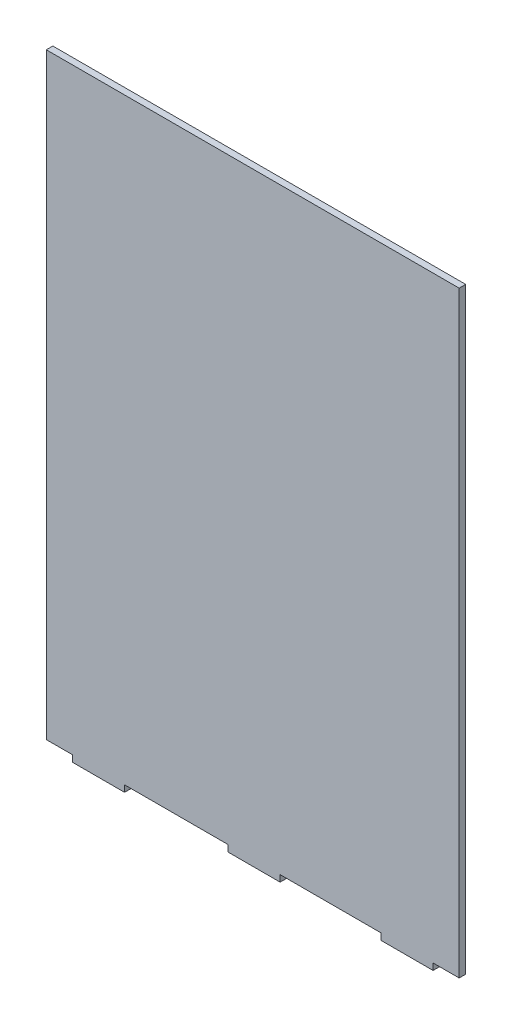
ISO-10303-21;
HEADER;
FILE_DESCRIPTION(('STEP AP214'),'2;1');
FILE_NAME('part.step','',(''),(''),'','','');
FILE_SCHEMA(('AUTOMOTIVE_DESIGN { 1 0 10303 214 1 1 1 1 }'));
ENDSEC;
DATA;
#1=APPLICATION_CONTEXT('core data for automotive mechanical design processes');
#2=APPLICATION_PROTOCOL_DEFINITION('international standard','automotive_design',2000,#1);
#3=PRODUCT_CONTEXT('',#1,'mechanical');
#4=PRODUCT('Part','Part','',(#3));
#5=PRODUCT_RELATED_PRODUCT_CATEGORY('part','',(#4));
#6=PRODUCT_DEFINITION_FORMATION('','',#4);
#7=PRODUCT_DEFINITION_CONTEXT('part definition',#1,'design');
#8=PRODUCT_DEFINITION('design','',#6,#7);
#9=PRODUCT_DEFINITION_SHAPE('','',#8);
#10=(LENGTH_UNIT() NAMED_UNIT(*) SI_UNIT(.MILLI.,.METRE.));
#11=(NAMED_UNIT(*) PLANE_ANGLE_UNIT() SI_UNIT($,.RADIAN.));
#12=(NAMED_UNIT(*) SI_UNIT($,.STERADIAN.) SOLID_ANGLE_UNIT());
#13=UNCERTAINTY_MEASURE_WITH_UNIT(LENGTH_MEASURE(1.E-05),#10,'distance_accuracy_value','');
#14=(GEOMETRIC_REPRESENTATION_CONTEXT(3) GLOBAL_UNCERTAINTY_ASSIGNED_CONTEXT((#13)) GLOBAL_UNIT_ASSIGNED_CONTEXT((#10,
#11,#12)) REPRESENTATION_CONTEXT('',''));
#15=CARTESIAN_POINT('',(0.,0.,0.));
#16=DIRECTION('',(0.,0.,1.));
#17=DIRECTION('',(1.,0.,0.));
#18=AXIS2_PLACEMENT_3D('',#15,#16,#17);
#19=CARTESIAN_POINT('',(0.,0.,3.175));
#20=DIRECTION('',(1.,0.,0.));
#21=DIRECTION('',(0.,0.,-1.));
#22=AXIS2_PLACEMENT_3D('',#19,#20,#21);
#23=PLANE('',#22);
#24=DIRECTION('',(0.,-1.,0.));
#25=VECTOR('',#24,1.);
#26=CARTESIAN_POINT('',(0.,0.,0.));
#27=LINE('',#26,#25);
#28=CARTESIAN_POINT('',(0.,290.83,0.));
#29=VERTEX_POINT('',#28);
#30=CARTESIAN_POINT('',(0.,0.,0.));
#31=VERTEX_POINT('',#30);
#32=EDGE_CURVE('E180',#29,#31,#27,.T.);
#33=ORIENTED_EDGE('',*,*,#32,.T.);
#34=DIRECTION('',(0.,0.,-1.));
#35=VECTOR('',#34,1.);
#36=CARTESIAN_POINT('',(0.,0.,3.175));
#37=LINE('',#36,#35);
#38=CARTESIAN_POINT('',(0.,0.,3.175));
#39=VERTEX_POINT('',#38);
#40=EDGE_CURVE('E11',#39,#31,#37,.T.);
#41=ORIENTED_EDGE('',*,*,#40,.F.);
#42=DIRECTION('',(0.,-1.,0.));
#43=VECTOR('',#42,1.);
#44=CARTESIAN_POINT('',(0.,0.,3.175));
#45=LINE('',#44,#43);
#46=CARTESIAN_POINT('',(0.,290.83,3.175));
#47=VERTEX_POINT('',#46);
#48=EDGE_CURVE('E210',#47,#39,#45,.T.);
#49=ORIENTED_EDGE('',*,*,#48,.F.);
#50=DIRECTION('',(0.,0.,-1.));
#51=VECTOR('',#50,1.);
#52=CARTESIAN_POINT('',(0.,290.83,3.175));
#53=LINE('',#52,#51);
#54=EDGE_CURVE('E176',#47,#29,#53,.T.);
#55=ORIENTED_EDGE('',*,*,#54,.T.);
#56=EDGE_LOOP('',(#33,#41,#49,#55));
#57=FACE_BOUND('',#56,.T.);
#58=ADVANCED_FACE('F36',(#57),#23,.F.);
#59=CARTESIAN_POINT('',(0.,0.,3.175));
#60=DIRECTION('',(0.,1.,0.));
#61=DIRECTION('',(0.,0.,1.));
#62=AXIS2_PLACEMENT_3D('',#59,#60,#61);
#63=PLANE('',#62);
#64=DIRECTION('',(1.,0.,0.));
#65=VECTOR('',#64,1.);
#66=CARTESIAN_POINT('',(0.,0.,0.));
#67=LINE('',#66,#65);
#68=CARTESIAN_POINT('',(12.7,0.,0.));
#69=VERTEX_POINT('',#68);
#70=EDGE_CURVE('E183',#31,#69,#67,.T.);
#71=ORIENTED_EDGE('',*,*,#70,.T.);
#72=DIRECTION('',(0.,0.,-1.));
#73=VECTOR('',#72,1.);
#74=CARTESIAN_POINT('',(12.7,0.,3.175));
#75=LINE('',#74,#73);
#76=CARTESIAN_POINT('',(12.7,0.,3.175));
#77=VERTEX_POINT('',#76);
#78=EDGE_CURVE('E44',#77,#69,#75,.T.);
#79=ORIENTED_EDGE('',*,*,#78,.F.);
#80=DIRECTION('',(1.,0.,0.));
#81=VECTOR('',#80,1.);
#82=CARTESIAN_POINT('',(0.,0.,3.175));
#83=LINE('',#82,#81);
#84=EDGE_CURVE('E119',#39,#77,#83,.T.);
#85=ORIENTED_EDGE('',*,*,#84,.F.);
#86=ORIENTED_EDGE('',*,*,#40,.T.);
#87=EDGE_LOOP('',(#71,#79,#85,#86));
#88=FACE_BOUND('',#87,.T.);
#89=ADVANCED_FACE('F308',(#88),#63,.F.);
#90=CARTESIAN_POINT('',(12.7,-3.175,3.175));
#91=DIRECTION('',(1.,0.,0.));
#92=DIRECTION('',(0.,0.,-1.));
#93=AXIS2_PLACEMENT_3D('',#90,#91,#92);
#94=PLANE('',#93);
#95=DIRECTION('',(0.,-1.,0.));
#96=VECTOR('',#95,1.);
#97=CARTESIAN_POINT('',(12.7,-3.175,0.));
#98=LINE('',#97,#96);
#99=CARTESIAN_POINT('',(12.7,-3.175,0.));
#100=VERTEX_POINT('',#99);
#101=EDGE_CURVE('E185',#69,#100,#98,.T.);
#102=ORIENTED_EDGE('',*,*,#101,.T.);
#103=DIRECTION('',(0.,0.,-1.));
#104=VECTOR('',#103,1.);
#105=CARTESIAN_POINT('',(12.7,-3.175,3.175));
#106=LINE('',#105,#104);
#107=CARTESIAN_POINT('',(12.7,-3.175,3.175));
#108=VERTEX_POINT('',#107);
#109=EDGE_CURVE('E241',#108,#100,#106,.T.);
#110=ORIENTED_EDGE('',*,*,#109,.F.);
#111=DIRECTION('',(0.,-1.,0.));
#112=VECTOR('',#111,1.);
#113=CARTESIAN_POINT('',(12.7,-3.175,3.175));
#114=LINE('',#113,#112);
#115=EDGE_CURVE('E249',#77,#108,#114,.T.);
#116=ORIENTED_EDGE('',*,*,#115,.F.);
#117=ORIENTED_EDGE('',*,*,#78,.T.);
#118=EDGE_LOOP('',(#102,#110,#116,#117));
#119=FACE_BOUND('',#118,.T.);
#120=ADVANCED_FACE('F247',(#119),#94,.F.);
#121=CARTESIAN_POINT('',(12.7,-3.175,3.175));
#122=DIRECTION('',(0.,1.,0.));
#123=DIRECTION('',(-1.,0.,0.));
#124=AXIS2_PLACEMENT_3D('',#121,#122,#123);
#125=PLANE('',#124);
#126=DIRECTION('',(1.,0.,0.));
#127=VECTOR('',#126,1.);
#128=CARTESIAN_POINT('',(12.7,-3.175,0.));
#129=LINE('',#128,#127);
#130=CARTESIAN_POINT('',(38.1,-3.175,0.));
#131=VERTEX_POINT('',#130);
#132=EDGE_CURVE('E187',#100,#131,#129,.T.);
#133=ORIENTED_EDGE('',*,*,#132,.T.);
#134=DIRECTION('',(0.,0.,-1.));
#135=VECTOR('',#134,1.);
#136=CARTESIAN_POINT('',(38.1,-3.175,3.175));
#137=LINE('',#136,#135);
#138=CARTESIAN_POINT('',(38.1,-3.175,3.175));
#139=VERTEX_POINT('',#138);
#140=EDGE_CURVE('E238',#139,#131,#137,.T.);
#141=ORIENTED_EDGE('',*,*,#140,.F.);
#142=DIRECTION('',(1.,0.,0.));
#143=VECTOR('',#142,1.);
#144=CARTESIAN_POINT('',(12.7,-3.175,3.175));
#145=LINE('',#144,#143);
#146=EDGE_CURVE('E267',#108,#139,#145,.T.);
#147=ORIENTED_EDGE('',*,*,#146,.F.);
#148=ORIENTED_EDGE('',*,*,#109,.T.);
#149=EDGE_LOOP('',(#133,#141,#147,#148));
#150=FACE_BOUND('',#149,.T.);
#151=ADVANCED_FACE('F258',(#150),#125,.F.);
#152=CARTESIAN_POINT('',(38.1,-3.175,3.175));
#153=DIRECTION('',(-1.,0.,0.));
#154=DIRECTION('',(0.,0.,1.));
#155=AXIS2_PLACEMENT_3D('',#152,#153,#154);
#156=PLANE('',#155);
#157=DIRECTION('',(0.,1.,0.));
#158=VECTOR('',#157,1.);
#159=CARTESIAN_POINT('',(38.1,-3.175,0.));
#160=LINE('',#159,#158);
#161=CARTESIAN_POINT('',(38.1,0.,0.));
#162=VERTEX_POINT('',#161);
#163=EDGE_CURVE('E189',#131,#162,#160,.T.);
#164=ORIENTED_EDGE('',*,*,#163,.T.);
#165=DIRECTION('',(0.,0.,-1.));
#166=VECTOR('',#165,1.);
#167=CARTESIAN_POINT('',(38.1,0.,3.175));
#168=LINE('',#167,#166);
#169=CARTESIAN_POINT('',(38.1,0.,3.175));
#170=VERTEX_POINT('',#169);
#171=EDGE_CURVE('E235',#170,#162,#168,.T.);
#172=ORIENTED_EDGE('',*,*,#171,.F.);
#173=DIRECTION('',(0.,1.,0.));
#174=VECTOR('',#173,1.);
#175=CARTESIAN_POINT('',(38.1,-3.175,3.175));
#176=LINE('',#175,#174);
#177=EDGE_CURVE('E264',#139,#170,#176,.T.);
#178=ORIENTED_EDGE('',*,*,#177,.F.);
#179=ORIENTED_EDGE('',*,*,#140,.T.);
#180=EDGE_LOOP('',(#164,#172,#178,#179));
#181=FACE_BOUND('',#180,.T.);
#182=ADVANCED_FACE('F262',(#181),#156,.F.);
#183=CARTESIAN_POINT('',(38.1,0.,3.175));
#184=DIRECTION('',(0.,1.,0.));
#185=DIRECTION('',(-1.,0.,0.));
#186=AXIS2_PLACEMENT_3D('',#183,#184,#185);
#187=PLANE('',#186);
#188=DIRECTION('',(1.,0.,0.));
#189=VECTOR('',#188,1.);
#190=CARTESIAN_POINT('',(38.1,0.,0.));
#191=LINE('',#190,#189);
#192=CARTESIAN_POINT('',(88.4153708647125,0.,0.));
#193=VERTEX_POINT('',#192);
#194=EDGE_CURVE('E191',#162,#193,#191,.T.);
#195=ORIENTED_EDGE('',*,*,#194,.T.);
#196=DIRECTION('',(0.,0.,-1.));
#197=VECTOR('',#196,1.);
#198=CARTESIAN_POINT('',(88.4153708647125,0.,3.175));
#199=LINE('',#198,#197);
#200=CARTESIAN_POINT('',(88.4153708647125,0.,3.175));
#201=VERTEX_POINT('',#200);
#202=EDGE_CURVE('E232',#201,#193,#199,.T.);
#203=ORIENTED_EDGE('',*,*,#202,.F.);
#204=DIRECTION('',(1.,0.,0.));
#205=VECTOR('',#204,1.);
#206=CARTESIAN_POINT('',(38.1,0.,3.175));
#207=LINE('',#206,#205);
#208=EDGE_CURVE('E266',#170,#201,#207,.T.);
#209=ORIENTED_EDGE('',*,*,#208,.F.);
#210=ORIENTED_EDGE('',*,*,#171,.T.);
#211=EDGE_LOOP('',(#195,#203,#209,#210));
#212=FACE_BOUND('',#211,.T.);
#213=ADVANCED_FACE('F321',(#212),#187,.F.);
#214=CARTESIAN_POINT('',(88.4153708647125,-3.17499999999999,3.175));
#215=DIRECTION('',(1.,0.,0.));
#216=DIRECTION('',(0.,0.,-1.));
#217=AXIS2_PLACEMENT_3D('',#214,#215,#216);
#218=PLANE('',#217);
#219=DIRECTION('',(0.,-1.,0.));
#220=VECTOR('',#219,1.);
#221=CARTESIAN_POINT('',(88.4153708647125,-3.17499999999999,0.));
#222=LINE('',#221,#220);
#223=CARTESIAN_POINT('',(88.4153708647125,-3.17499999999999,0.));
#224=VERTEX_POINT('',#223);
#225=EDGE_CURVE('E193',#193,#224,#222,.T.);
#226=ORIENTED_EDGE('',*,*,#225,.T.);
#227=DIRECTION('',(0.,0.,-1.));
#228=VECTOR('',#227,1.);
#229=CARTESIAN_POINT('',(88.4153708647125,-3.17499999999999,3.175));
#230=LINE('',#229,#228);
#231=CARTESIAN_POINT('',(88.4153708647125,-3.17499999999999,3.175));
#232=VERTEX_POINT('',#231);
#233=EDGE_CURVE('E229',#232,#224,#230,.T.);
#234=ORIENTED_EDGE('',*,*,#233,.F.);
#235=DIRECTION('',(0.,-1.,0.));
#236=VECTOR('',#235,1.);
#237=CARTESIAN_POINT('',(88.4153708647125,-3.17499999999999,3.175));
#238=LINE('',#237,#236);
#239=EDGE_CURVE('E269',#201,#232,#238,.T.);
#240=ORIENTED_EDGE('',*,*,#239,.F.);
#241=ORIENTED_EDGE('',*,*,#202,.T.);
#242=EDGE_LOOP('',(#226,#234,#240,#241));
#243=FACE_BOUND('',#242,.T.);
#244=ADVANCED_FACE('F324',(#243),#218,.F.);
#245=CARTESIAN_POINT('',(88.4153708647125,-3.17499999999999,3.175));
#246=DIRECTION('',(0.,1.,0.));
#247=DIRECTION('',(-1.,0.,0.));
#248=AXIS2_PLACEMENT_3D('',#245,#246,#247);
#249=PLANE('',#248);
#250=DIRECTION('',(1.,0.,0.));
#251=VECTOR('',#250,1.);
#252=CARTESIAN_POINT('',(88.4153708647125,-3.17499999999999,0.));
#253=LINE('',#252,#251);
#254=CARTESIAN_POINT('',(113.815370864712,-3.175,0.));
#255=VERTEX_POINT('',#254);
#256=EDGE_CURVE('E195',#224,#255,#253,.T.);
#257=ORIENTED_EDGE('',*,*,#256,.T.);
#258=DIRECTION('',(0.,0.,-1.));
#259=VECTOR('',#258,1.);
#260=CARTESIAN_POINT('',(113.815370864712,-3.175,3.175));
#261=LINE('',#260,#259);
#262=CARTESIAN_POINT('',(113.815370864712,-3.175,3.175));
#263=VERTEX_POINT('',#262);
#264=EDGE_CURVE('E226',#263,#255,#261,.T.);
#265=ORIENTED_EDGE('',*,*,#264,.F.);
#266=DIRECTION('',(1.,0.,0.));
#267=VECTOR('',#266,1.);
#268=CARTESIAN_POINT('',(88.4153708647125,-3.17499999999999,3.175));
#269=LINE('',#268,#267);
#270=EDGE_CURVE('E275',#232,#263,#269,.T.);
#271=ORIENTED_EDGE('',*,*,#270,.F.);
#272=ORIENTED_EDGE('',*,*,#233,.T.);
#273=EDGE_LOOP('',(#257,#265,#271,#272));
#274=FACE_BOUND('',#273,.T.);
#275=ADVANCED_FACE('F328',(#274),#249,.F.);
#276=CARTESIAN_POINT('',(113.815370864712,-3.175,3.175));
#277=DIRECTION('',(-1.,0.,0.));
#278=DIRECTION('',(0.,0.,1.));
#279=AXIS2_PLACEMENT_3D('',#276,#277,#278);
#280=PLANE('',#279);
#281=DIRECTION('',(0.,1.,0.));
#282=VECTOR('',#281,1.);
#283=CARTESIAN_POINT('',(113.815370864712,-3.175,0.));
#284=LINE('',#283,#282);
#285=CARTESIAN_POINT('',(113.815370864712,0.,0.));
#286=VERTEX_POINT('',#285);
#287=EDGE_CURVE('E197',#255,#286,#284,.T.);
#288=ORIENTED_EDGE('',*,*,#287,.T.);
#289=DIRECTION('',(0.,0.,-1.));
#290=VECTOR('',#289,1.);
#291=CARTESIAN_POINT('',(113.815370864712,0.,3.175));
#292=LINE('',#291,#290);
#293=CARTESIAN_POINT('',(113.815370864712,0.,3.175));
#294=VERTEX_POINT('',#293);
#295=EDGE_CURVE('E223',#294,#286,#292,.T.);
#296=ORIENTED_EDGE('',*,*,#295,.F.);
#297=DIRECTION('',(0.,1.,0.));
#298=VECTOR('',#297,1.);
#299=CARTESIAN_POINT('',(113.815370864712,-3.175,3.175));
#300=LINE('',#299,#298);
#301=EDGE_CURVE('E277',#263,#294,#300,.T.);
#302=ORIENTED_EDGE('',*,*,#301,.F.);
#303=ORIENTED_EDGE('',*,*,#264,.T.);
#304=EDGE_LOOP('',(#288,#296,#302,#303));
#305=FACE_BOUND('',#304,.T.);
#306=ADVANCED_FACE('F332',(#305),#280,.F.);
#307=CARTESIAN_POINT('',(113.815370864712,0.,3.175));
#308=DIRECTION('',(0.,1.,0.));
#309=DIRECTION('',(0.,0.,1.));
#310=AXIS2_PLACEMENT_3D('',#307,#308,#309);
#311=PLANE('',#310);
#312=DIRECTION('',(1.,0.,0.));
#313=VECTOR('',#312,1.);
#314=CARTESIAN_POINT('',(113.815370864712,0.,0.));
#315=LINE('',#314,#313);
#316=CARTESIAN_POINT('',(162.88004,0.,0.));
#317=VERTEX_POINT('',#316);
#318=EDGE_CURVE('E199',#286,#317,#315,.T.);
#319=ORIENTED_EDGE('',*,*,#318,.T.);
#320=DIRECTION('',(0.,0.,-1.));
#321=VECTOR('',#320,1.);
#322=CARTESIAN_POINT('',(162.88004,0.,3.175));
#323=LINE('',#322,#321);
#324=CARTESIAN_POINT('',(162.88004,0.,3.175));
#325=VERTEX_POINT('',#324);
#326=EDGE_CURVE('E220',#325,#317,#323,.T.);
#327=ORIENTED_EDGE('',*,*,#326,.F.);
#328=DIRECTION('',(1.,0.,0.));
#329=VECTOR('',#328,1.);
#330=CARTESIAN_POINT('',(113.815370864712,0.,3.175));
#331=LINE('',#330,#329);
#332=EDGE_CURVE('E279',#294,#325,#331,.T.);
#333=ORIENTED_EDGE('',*,*,#332,.F.);
#334=ORIENTED_EDGE('',*,*,#295,.T.);
#335=EDGE_LOOP('',(#319,#327,#333,#334));
#336=FACE_BOUND('',#335,.T.);
#337=ADVANCED_FACE('F336',(#336),#311,.F.);
#338=CARTESIAN_POINT('',(162.88004,0.,3.175));
#339=DIRECTION('',(1.,0.,0.));
#340=DIRECTION('',(0.,0.,-1.));
#341=AXIS2_PLACEMENT_3D('',#338,#339,#340);
#342=PLANE('',#341);
#343=DIRECTION('',(0.,-1.,0.));
#344=VECTOR('',#343,1.);
#345=CARTESIAN_POINT('',(162.88004,0.,0.));
#346=LINE('',#345,#344);
#347=CARTESIAN_POINT('',(162.88004,-3.175,0.));
#348=VERTEX_POINT('',#347);
#349=EDGE_CURVE('E201',#317,#348,#346,.T.);
#350=ORIENTED_EDGE('',*,*,#349,.T.);
#351=DIRECTION('',(0.,0.,-1.));
#352=VECTOR('',#351,1.);
#353=CARTESIAN_POINT('',(162.88004,-3.175,3.175));
#354=LINE('',#353,#352);
#355=CARTESIAN_POINT('',(162.88004,-3.175,3.175));
#356=VERTEX_POINT('',#355);
#357=EDGE_CURVE('E217',#356,#348,#354,.T.);
#358=ORIENTED_EDGE('',*,*,#357,.F.);
#359=DIRECTION('',(0.,-1.,0.));
#360=VECTOR('',#359,1.);
#361=CARTESIAN_POINT('',(162.88004,0.,3.175));
#362=LINE('',#361,#360);
#363=EDGE_CURVE('E281',#325,#356,#362,.T.);
#364=ORIENTED_EDGE('',*,*,#363,.F.);
#365=ORIENTED_EDGE('',*,*,#326,.T.);
#366=EDGE_LOOP('',(#350,#358,#364,#365));
#367=FACE_BOUND('',#366,.T.);
#368=ADVANCED_FACE('F340',(#367),#342,.F.);
#369=CARTESIAN_POINT('',(162.88004,-3.175,3.175));
#370=DIRECTION('',(0.,1.,0.));
#371=DIRECTION('',(0.,0.,1.));
#372=AXIS2_PLACEMENT_3D('',#369,#370,#371);
#373=PLANE('',#372);
#374=DIRECTION('',(1.,0.,0.));
#375=VECTOR('',#374,1.);
#376=CARTESIAN_POINT('',(162.88004,-3.175,0.));
#377=LINE('',#376,#375);
#378=CARTESIAN_POINT('',(188.28004,-3.175,0.));
#379=VERTEX_POINT('',#378);
#380=EDGE_CURVE('E203',#348,#379,#377,.T.);
#381=ORIENTED_EDGE('',*,*,#380,.T.);
#382=DIRECTION('',(0.,0.,-1.));
#383=VECTOR('',#382,1.);
#384=CARTESIAN_POINT('',(188.28004,-3.175,3.175));
#385=LINE('',#384,#383);
#386=CARTESIAN_POINT('',(188.28004,-3.175,3.175));
#387=VERTEX_POINT('',#386);
#388=EDGE_CURVE('E214',#387,#379,#385,.T.);
#389=ORIENTED_EDGE('',*,*,#388,.F.);
#390=DIRECTION('',(1.,0.,0.));
#391=VECTOR('',#390,1.);
#392=CARTESIAN_POINT('',(162.88004,-3.175,3.175));
#393=LINE('',#392,#391);
#394=EDGE_CURVE('E283',#356,#387,#393,.T.);
#395=ORIENTED_EDGE('',*,*,#394,.F.);
#396=ORIENTED_EDGE('',*,*,#357,.T.);
#397=EDGE_LOOP('',(#381,#389,#395,#396));
#398=FACE_BOUND('',#397,.T.);
#399=ADVANCED_FACE('F289',(#398),#373,.F.);
#400=CARTESIAN_POINT('',(188.28004,0.,3.175));
#401=DIRECTION('',(-1.,0.,0.));
#402=DIRECTION('',(0.,0.,1.));
#403=AXIS2_PLACEMENT_3D('',#400,#401,#402);
#404=PLANE('',#403);
#405=DIRECTION('',(0.,1.,0.));
#406=VECTOR('',#405,1.);
#407=CARTESIAN_POINT('',(188.28004,0.,0.));
#408=LINE('',#407,#406);
#409=CARTESIAN_POINT('',(188.28004,0.,0.));
#410=VERTEX_POINT('',#409);
#411=EDGE_CURVE('E205',#379,#410,#408,.T.);
#412=ORIENTED_EDGE('',*,*,#411,.T.);
#413=DIRECTION('',(0.,0.,-1.));
#414=VECTOR('',#413,1.);
#415=CARTESIAN_POINT('',(188.28004,0.,3.175));
#416=LINE('',#415,#414);
#417=CARTESIAN_POINT('',(188.28004,0.,3.175));
#418=VERTEX_POINT('',#417);
#419=EDGE_CURVE('E171',#418,#410,#416,.T.);
#420=ORIENTED_EDGE('',*,*,#419,.F.);
#421=DIRECTION('',(0.,1.,0.));
#422=VECTOR('',#421,1.);
#423=CARTESIAN_POINT('',(188.28004,0.,3.175));
#424=LINE('',#423,#422);
#425=EDGE_CURVE('E162',#387,#418,#424,.T.);
#426=ORIENTED_EDGE('',*,*,#425,.F.);
#427=ORIENTED_EDGE('',*,*,#388,.T.);
#428=EDGE_LOOP('',(#412,#420,#426,#427));
#429=FACE_BOUND('',#428,.T.);
#430=ADVANCED_FACE('F293',(#429),#404,.F.);
#431=CARTESIAN_POINT('',(188.28004,0.,3.175));
#432=DIRECTION('',(0.,1.,0.));
#433=DIRECTION('',(0.,0.,1.));
#434=AXIS2_PLACEMENT_3D('',#431,#432,#433);
#435=PLANE('',#434);
#436=DIRECTION('',(1.,0.,0.));
#437=VECTOR('',#436,1.);
#438=CARTESIAN_POINT('',(188.28004,0.,0.));
#439=LINE('',#438,#437);
#440=CARTESIAN_POINT('',(200.98004,0.,0.));
#441=VERTEX_POINT('',#440);
#442=EDGE_CURVE('E170',#410,#441,#439,.T.);
#443=ORIENTED_EDGE('',*,*,#442,.T.);
#444=DIRECTION('',(0.,0.,-1.));
#445=VECTOR('',#444,1.);
#446=CARTESIAN_POINT('',(200.98004,0.,3.175));
#447=LINE('',#446,#445);
#448=CARTESIAN_POINT('',(200.98004,0.,3.175));
#449=VERTEX_POINT('',#448);
#450=EDGE_CURVE('E167',#449,#441,#447,.T.);
#451=ORIENTED_EDGE('',*,*,#450,.F.);
#452=DIRECTION('',(1.,0.,0.));
#453=VECTOR('',#452,1.);
#454=CARTESIAN_POINT('',(188.28004,0.,3.175));
#455=LINE('',#454,#453);
#456=EDGE_CURVE('E156',#418,#449,#455,.T.);
#457=ORIENTED_EDGE('',*,*,#456,.F.);
#458=ORIENTED_EDGE('',*,*,#419,.T.);
#459=EDGE_LOOP('',(#443,#451,#457,#458));
#460=FACE_BOUND('',#459,.T.);
#461=ADVANCED_FACE('F168',(#460),#435,.F.);
#462=CARTESIAN_POINT('',(200.98004,0.,3.175));
#463=DIRECTION('',(-1.,0.,0.));
#464=DIRECTION('',(0.,0.,1.));
#465=AXIS2_PLACEMENT_3D('',#462,#463,#464);
#466=PLANE('',#465);
#467=DIRECTION('',(0.,1.,0.));
#468=VECTOR('',#467,1.);
#469=CARTESIAN_POINT('',(200.98004,0.,0.));
#470=LINE('',#469,#468);
#471=CARTESIAN_POINT('',(200.98004,290.83,0.));
#472=VERTEX_POINT('',#471);
#473=EDGE_CURVE('E105',#441,#472,#470,.T.);
#474=ORIENTED_EDGE('',*,*,#473,.T.);
#475=DIRECTION('',(0.,0.,-1.));
#476=VECTOR('',#475,1.);
#477=CARTESIAN_POINT('',(200.98004,290.83,3.175));
#478=LINE('',#477,#476);
#479=CARTESIAN_POINT('',(200.98004,290.83,3.175));
#480=VERTEX_POINT('',#479);
#481=EDGE_CURVE('E172',#480,#472,#478,.T.);
#482=ORIENTED_EDGE('',*,*,#481,.F.);
#483=DIRECTION('',(0.,1.,0.));
#484=VECTOR('',#483,1.);
#485=CARTESIAN_POINT('',(200.98004,0.,3.175));
#486=LINE('',#485,#484);
#487=EDGE_CURVE('E160',#449,#480,#486,.T.);
#488=ORIENTED_EDGE('',*,*,#487,.F.);
#489=ORIENTED_EDGE('',*,*,#450,.T.);
#490=EDGE_LOOP('',(#474,#482,#488,#489));
#491=FACE_BOUND('',#490,.T.);
#492=ADVANCED_FACE('F174',(#491),#466,.F.);
#493=CARTESIAN_POINT('',(0.,290.83,3.175));
#494=DIRECTION('',(0.,-1.,0.));
#495=DIRECTION('',(0.,0.,-1.));
#496=AXIS2_PLACEMENT_3D('',#493,#494,#495);
#497=PLANE('',#496);
#498=DIRECTION('',(-1.,0.,0.));
#499=VECTOR('',#498,1.);
#500=CARTESIAN_POINT('',(0.,290.83,0.));
#501=LINE('',#500,#499);
#502=EDGE_CURVE('E111',#472,#29,#501,.T.);
#503=ORIENTED_EDGE('',*,*,#502,.T.);
#504=ORIENTED_EDGE('',*,*,#54,.F.);
#505=DIRECTION('',(-1.,0.,0.));
#506=VECTOR('',#505,1.);
#507=CARTESIAN_POINT('',(0.,290.83,3.175));
#508=LINE('',#507,#506);
#509=EDGE_CURVE('E52',#480,#47,#508,.T.);
#510=ORIENTED_EDGE('',*,*,#509,.F.);
#511=ORIENTED_EDGE('',*,*,#481,.T.);
#512=EDGE_LOOP('',(#503,#504,#510,#511));
#513=FACE_BOUND('',#512,.T.);
#514=ADVANCED_FACE('F297',(#513),#497,.F.);
#515=CARTESIAN_POINT('',(0.,0.,3.175));
#516=DIRECTION('',(0.,0.,-1.));
#517=DIRECTION('',(-1.,0.,0.));
#518=AXIS2_PLACEMENT_3D('',#515,#516,#517);
#519=PLANE('',#518);
#520=ORIENTED_EDGE('',*,*,#48,.T.);
#521=ORIENTED_EDGE('',*,*,#84,.T.);
#522=ORIENTED_EDGE('',*,*,#115,.T.);
#523=ORIENTED_EDGE('',*,*,#146,.T.);
#524=ORIENTED_EDGE('',*,*,#177,.T.);
#525=ORIENTED_EDGE('',*,*,#208,.T.);
#526=ORIENTED_EDGE('',*,*,#239,.T.);
#527=ORIENTED_EDGE('',*,*,#270,.T.);
#528=ORIENTED_EDGE('',*,*,#301,.T.);
#529=ORIENTED_EDGE('',*,*,#332,.T.);
#530=ORIENTED_EDGE('',*,*,#363,.T.);
#531=ORIENTED_EDGE('',*,*,#394,.T.);
#532=ORIENTED_EDGE('',*,*,#425,.T.);
#533=ORIENTED_EDGE('',*,*,#456,.T.);
#534=ORIENTED_EDGE('',*,*,#487,.T.);
#535=ORIENTED_EDGE('',*,*,#509,.T.);
#536=EDGE_LOOP('',(#520,#521,#522,#523,#524,#525,#526,#527,#528,#529,#530,#531,#532,#533,#534,#535));
#537=FACE_BOUND('',#536,.T.);
#538=ADVANCED_FACE('F158',(#537),#519,.F.);
#539=CARTESIAN_POINT('',(0.,0.,0.));
#540=DIRECTION('',(0.,0.,-1.));
#541=DIRECTION('',(-1.,0.,0.));
#542=AXIS2_PLACEMENT_3D('',#539,#540,#541);
#543=PLANE('',#542);
#544=ORIENTED_EDGE('',*,*,#32,.F.);
#545=ORIENTED_EDGE('',*,*,#502,.F.);
#546=ORIENTED_EDGE('',*,*,#473,.F.);
#547=ORIENTED_EDGE('',*,*,#442,.F.);
#548=ORIENTED_EDGE('',*,*,#411,.F.);
#549=ORIENTED_EDGE('',*,*,#380,.F.);
#550=ORIENTED_EDGE('',*,*,#349,.F.);
#551=ORIENTED_EDGE('',*,*,#318,.F.);
#552=ORIENTED_EDGE('',*,*,#287,.F.);
#553=ORIENTED_EDGE('',*,*,#256,.F.);
#554=ORIENTED_EDGE('',*,*,#225,.F.);
#555=ORIENTED_EDGE('',*,*,#194,.F.);
#556=ORIENTED_EDGE('',*,*,#163,.F.);
#557=ORIENTED_EDGE('',*,*,#132,.F.);
#558=ORIENTED_EDGE('',*,*,#101,.F.);
#559=ORIENTED_EDGE('',*,*,#70,.F.);
#560=EDGE_LOOP('',(#544,#545,#546,#547,#548,#549,#550,#551,#552,#553,#554,#555,#556,#557,#558,#559));
#561=FACE_BOUND('',#560,.T.);
#562=ADVANCED_FACE('F253',(#561),#543,.T.);
#563=CLOSED_SHELL('',(#58,#89,#120,#151,#182,#213,#244,#275,#306,#337,#368,#399,#430,#461,#492,
#514,#538,#562));
#564=MANIFOLD_SOLID_BREP('B2',#563);
#565=ADVANCED_BREP_SHAPE_REPRESENTATION('',(#18,#564),#14);
#566=SHAPE_DEFINITION_REPRESENTATION(#9,#565);
ENDSEC;
END-ISO-10303-21;
